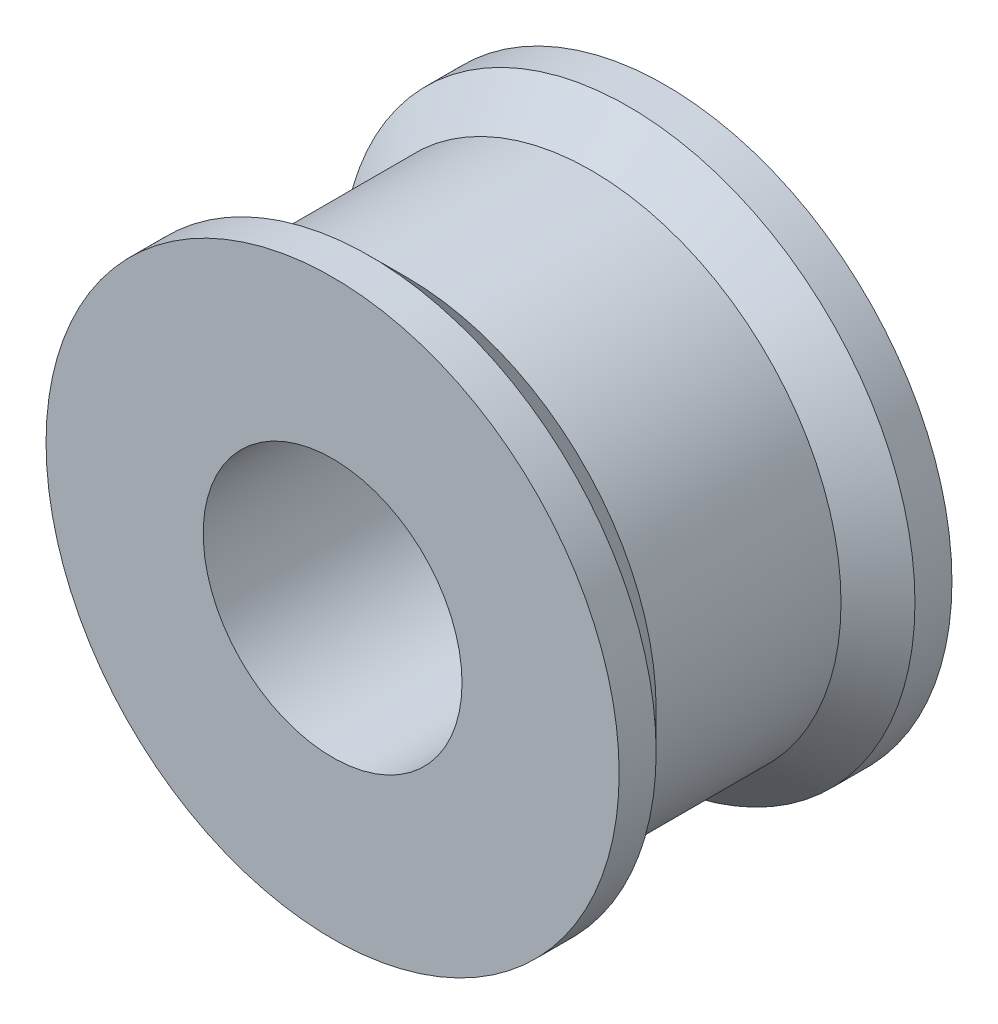
ISO-10303-21;
HEADER;
FILE_DESCRIPTION(('STEP AP214'),'2;1');
FILE_NAME('part.step','',(''),(''),'','','');
FILE_SCHEMA(('AUTOMOTIVE_DESIGN { 1 0 10303 214 1 1 1 1 }'));
ENDSEC;
DATA;
#1=APPLICATION_CONTEXT('core data for automotive mechanical design processes');
#2=APPLICATION_PROTOCOL_DEFINITION('international standard','automotive_design',2000,#1);
#3=PRODUCT_CONTEXT('',#1,'mechanical');
#4=PRODUCT('Part','Part','',(#3));
#5=PRODUCT_RELATED_PRODUCT_CATEGORY('part','',(#4));
#6=PRODUCT_DEFINITION_FORMATION('','',#4);
#7=PRODUCT_DEFINITION_CONTEXT('part definition',#1,'design');
#8=PRODUCT_DEFINITION('design','',#6,#7);
#9=PRODUCT_DEFINITION_SHAPE('','',#8);
#10=(LENGTH_UNIT() NAMED_UNIT(*) SI_UNIT(.MILLI.,.METRE.));
#11=(NAMED_UNIT(*) PLANE_ANGLE_UNIT() SI_UNIT($,.RADIAN.));
#12=(NAMED_UNIT(*) SI_UNIT($,.STERADIAN.) SOLID_ANGLE_UNIT());
#13=UNCERTAINTY_MEASURE_WITH_UNIT(LENGTH_MEASURE(1.E-05),#10,'distance_accuracy_value','');
#14=(GEOMETRIC_REPRESENTATION_CONTEXT(3) GLOBAL_UNCERTAINTY_ASSIGNED_CONTEXT((#13)) GLOBAL_UNIT_ASSIGNED_CONTEXT((#10,
#11,#12)) REPRESENTATION_CONTEXT('',''));
#15=CARTESIAN_POINT('',(0.,0.,0.));
#16=DIRECTION('',(0.,0.,1.));
#17=DIRECTION('',(1.,0.,0.));
#18=AXIS2_PLACEMENT_3D('',#15,#16,#17);
#19=CARTESIAN_POINT('',(0.,0.,0.));
#20=DIRECTION('',(0.,0.,1.));
#21=DIRECTION('',(1.,0.,0.));
#22=AXIS2_PLACEMENT_3D('',#19,#20,#21);
#23=PLANE('',#22);
#24=CARTESIAN_POINT('',(0.,0.,0.));
#25=DIRECTION('',(0.,0.,1.));
#26=DIRECTION('',(1.,0.,0.));
#27=AXIS2_PLACEMENT_3D('',#24,#25,#26);
#28=CIRCLE('',#27,7.75);
#29=CARTESIAN_POINT('',(7.75,0.,0.));
#30=VERTEX_POINT('',#29);
#31=EDGE_CURVE('E42',#30,#30,#28,.T.);
#32=ORIENTED_EDGE('',*,*,#31,.F.);
#33=EDGE_LOOP('',(#32));
#34=FACE_BOUND('',#33,.T.);
#35=CARTESIAN_POINT('',(0.,0.,0.));
#36=DIRECTION('',(0.,0.,1.));
#37=DIRECTION('',(1.,0.,0.));
#38=AXIS2_PLACEMENT_3D('',#35,#36,#37);
#39=CIRCLE('',#38,3.5);
#40=CARTESIAN_POINT('',(3.5,0.,0.));
#41=VERTEX_POINT('',#40);
#42=EDGE_CURVE('E47',#41,#41,#39,.T.);
#43=ORIENTED_EDGE('',*,*,#42,.T.);
#44=EDGE_LOOP('',(#43));
#45=FACE_BOUND('',#44,.T.);
#46=ADVANCED_FACE('F31',(#34,#45),#23,.F.);
#47=CARTESIAN_POINT('',(0.,0.,1.));
#48=DIRECTION('',(0.,0.,-1.));
#49=DIRECTION('',(-1.,0.,0.));
#50=AXIS2_PLACEMENT_3D('',#47,#48,#49);
#51=CYLINDRICAL_SURFACE('',#50,7.75);
#52=CARTESIAN_POINT('',(0.,0.,1.));
#53=DIRECTION('',(0.,0.,1.));
#54=DIRECTION('',(1.,0.,0.));
#55=AXIS2_PLACEMENT_3D('',#52,#53,#54);
#56=CIRCLE('',#55,7.75);
#57=CARTESIAN_POINT('',(7.75,0.,1.));
#58=VERTEX_POINT('',#57);
#59=EDGE_CURVE('E38',#58,#58,#56,.T.);
#60=ORIENTED_EDGE('',*,*,#59,.F.);
#61=EDGE_LOOP('',(#60));
#62=FACE_BOUND('',#61,.T.);
#63=ORIENTED_EDGE('',*,*,#31,.T.);
#64=EDGE_LOOP('',(#63));
#65=FACE_BOUND('',#64,.T.);
#66=ADVANCED_FACE('F80',(#62,#65),#51,.T.);
#67=CARTESIAN_POINT('',(0.,0.,1.));
#68=DIRECTION('',(0.,0.,-1.));
#69=DIRECTION('',(-1.,0.,0.));
#70=AXIS2_PLACEMENT_3D('',#67,#68,#69);
#71=CYLINDRICAL_SURFACE('',#70,3.5);
#72=ORIENTED_EDGE('',*,*,#42,.F.);
#73=EDGE_LOOP('',(#72));
#74=FACE_BOUND('',#73,.T.);
#75=CARTESIAN_POINT('',(0.,0.,9.));
#76=DIRECTION('',(0.,0.,1.));
#77=DIRECTION('',(1.,0.,0.));
#78=AXIS2_PLACEMENT_3D('',#75,#76,#77);
#79=CIRCLE('',#78,3.5);
#80=CARTESIAN_POINT('',(3.5,0.,9.));
#81=VERTEX_POINT('',#80);
#82=EDGE_CURVE('E58',#81,#81,#79,.T.);
#83=ORIENTED_EDGE('',*,*,#82,.T.);
#84=EDGE_LOOP('',(#83));
#85=FACE_BOUND('',#84,.T.);
#86=ADVANCED_FACE('F64',(#74,#85),#71,.F.);
#87=CARTESIAN_POINT('',(0.,0.,4.5));
#88=DIRECTION('',(0.,0.,-1.));
#89=DIRECTION('',(-1.,0.,0.));
#90=AXIS2_PLACEMENT_3D('',#87,#88,#89);
#91=CYLINDRICAL_SURFACE('',#90,6.75);
#92=CARTESIAN_POINT('',(0.,0.,2.00000000000001));
#93=DIRECTION('',(0.,0.,1.));
#94=DIRECTION('',(1.,0.,0.));
#95=AXIS2_PLACEMENT_3D('',#92,#93,#94);
#96=CIRCLE('',#95,6.75);
#97=CARTESIAN_POINT('',(6.75,0.,2.00000000000001));
#98=VERTEX_POINT('',#97);
#99=EDGE_CURVE('E10',#98,#98,#96,.T.);
#100=ORIENTED_EDGE('',*,*,#99,.T.);
#101=EDGE_LOOP('',(#100));
#102=FACE_BOUND('',#101,.T.);
#103=CARTESIAN_POINT('',(0.,0.,6.99999999999999));
#104=DIRECTION('',(0.,0.,1.));
#105=DIRECTION('',(1.,0.,0.));
#106=AXIS2_PLACEMENT_3D('',#103,#104,#105);
#107=CIRCLE('',#106,6.75);
#108=CARTESIAN_POINT('',(6.75,0.,6.99999999999999));
#109=VERTEX_POINT('',#108);
#110=EDGE_CURVE('E51',#109,#109,#107,.T.);
#111=ORIENTED_EDGE('',*,*,#110,.F.);
#112=EDGE_LOOP('',(#111));
#113=FACE_BOUND('',#112,.T.);
#114=ADVANCED_FACE('F78',(#102,#113),#91,.T.);
#115=CARTESIAN_POINT('',(0.,0.,2.00000000000001));
#116=DIRECTION('',(0.,0.,-1.));
#117=DIRECTION('',(-1.,0.,0.));
#118=AXIS2_PLACEMENT_3D('',#115,#116,#117);
#119=CONICAL_SURFACE('',#118,6.75,0.785398163397443);
#120=ORIENTED_EDGE('',*,*,#59,.T.);
#121=EDGE_LOOP('',(#120));
#122=FACE_BOUND('',#121,.T.);
#123=ORIENTED_EDGE('',*,*,#99,.F.);
#124=EDGE_LOOP('',(#123));
#125=FACE_BOUND('',#124,.T.);
#126=ADVANCED_FACE('F33',(#122,#125),#119,.T.);
#127=CARTESIAN_POINT('',(0.,0.,9.));
#128=DIRECTION('',(0.,0.,-1.));
#129=DIRECTION('',(1.,0.,0.));
#130=AXIS2_PLACEMENT_3D('',#127,#128,#129);
#131=PLANE('',#130);
#132=CARTESIAN_POINT('',(0.,0.,9.));
#133=DIRECTION('',(0.,0.,1.));
#134=DIRECTION('',(1.,0.,0.));
#135=AXIS2_PLACEMENT_3D('',#132,#133,#134);
#136=CIRCLE('',#135,7.75);
#137=CARTESIAN_POINT('',(7.75,0.,9.));
#138=VERTEX_POINT('',#137);
#139=EDGE_CURVE('E55',#138,#138,#136,.T.);
#140=ORIENTED_EDGE('',*,*,#139,.T.);
#141=EDGE_LOOP('',(#140));
#142=FACE_BOUND('',#141,.T.);
#143=ORIENTED_EDGE('',*,*,#82,.F.);
#144=EDGE_LOOP('',(#143));
#145=FACE_BOUND('',#144,.T.);
#146=ADVANCED_FACE('F66',(#142,#145),#131,.F.);
#147=CARTESIAN_POINT('',(0.,0.,8.));
#148=DIRECTION('',(0.,0.,1.));
#149=DIRECTION('',(-1.,0.,0.));
#150=AXIS2_PLACEMENT_3D('',#147,#148,#149);
#151=CYLINDRICAL_SURFACE('',#150,7.75);
#152=CARTESIAN_POINT('',(0.,0.,8.));
#153=DIRECTION('',(0.,0.,1.));
#154=DIRECTION('',(1.,0.,0.));
#155=AXIS2_PLACEMENT_3D('',#152,#153,#154);
#156=CIRCLE('',#155,7.75);
#157=CARTESIAN_POINT('',(7.75,0.,8.));
#158=VERTEX_POINT('',#157);
#159=EDGE_CURVE('E54',#158,#158,#156,.T.);
#160=ORIENTED_EDGE('',*,*,#159,.T.);
#161=EDGE_LOOP('',(#160));
#162=FACE_BOUND('',#161,.T.);
#163=ORIENTED_EDGE('',*,*,#139,.F.);
#164=EDGE_LOOP('',(#163));
#165=FACE_BOUND('',#164,.T.);
#166=ADVANCED_FACE('F68',(#162,#165),#151,.T.);
#167=CARTESIAN_POINT('',(0.,0.,6.99999999999999));
#168=DIRECTION('',(0.,0.,1.));
#169=DIRECTION('',(-1.,0.,0.));
#170=AXIS2_PLACEMENT_3D('',#167,#168,#169);
#171=CONICAL_SURFACE('',#170,6.75,0.785398163397443);
#172=ORIENTED_EDGE('',*,*,#159,.F.);
#173=EDGE_LOOP('',(#172));
#174=FACE_BOUND('',#173,.T.);
#175=ORIENTED_EDGE('',*,*,#110,.T.);
#176=EDGE_LOOP('',(#175));
#177=FACE_BOUND('',#176,.T.);
#178=ADVANCED_FACE('F75',(#174,#177),#171,.T.);
#179=CLOSED_SHELL('',(#46,#66,#86,#114,#126,#146,#166,#178));
#180=MANIFOLD_SOLID_BREP('B2',#179);
#181=ADVANCED_BREP_SHAPE_REPRESENTATION('',(#18,#180),#14);
#182=SHAPE_DEFINITION_REPRESENTATION(#9,#181);
ENDSEC;
END-ISO-10303-21;
